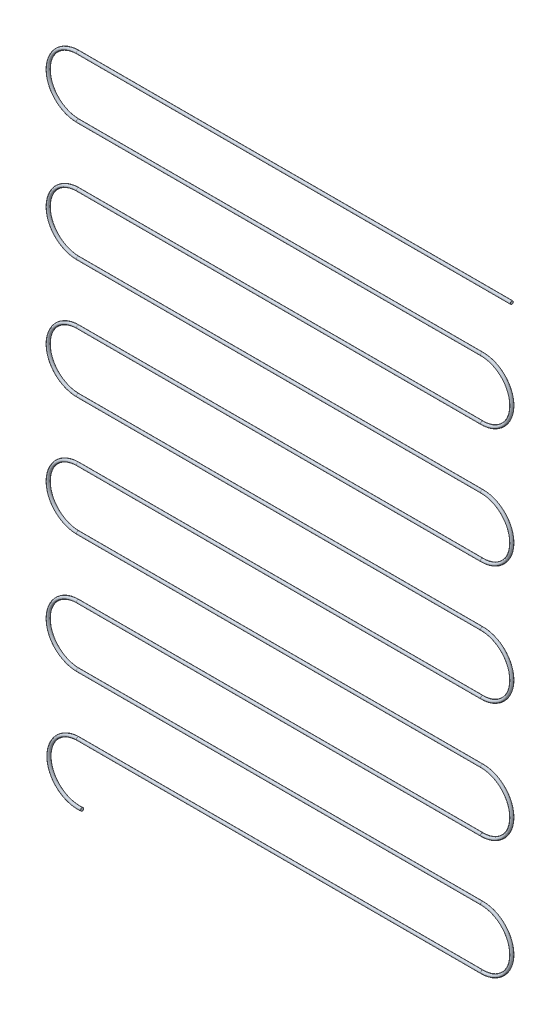
ISO-10303-21;
HEADER;
FILE_DESCRIPTION(('STEP AP214'),'2;1');
FILE_NAME('part.step','',(''),(''),'','','');
FILE_SCHEMA(('AUTOMOTIVE_DESIGN { 1 0 10303 214 1 1 1 1 }'));
ENDSEC;
DATA;
#1=APPLICATION_CONTEXT('core data for automotive mechanical design processes');
#2=APPLICATION_PROTOCOL_DEFINITION('international standard','automotive_design',2000,#1);
#3=PRODUCT_CONTEXT('',#1,'mechanical');
#4=PRODUCT('Part','Part','',(#3));
#5=PRODUCT_RELATED_PRODUCT_CATEGORY('part','',(#4));
#6=PRODUCT_DEFINITION_FORMATION('','',#4);
#7=PRODUCT_DEFINITION_CONTEXT('part definition',#1,'design');
#8=PRODUCT_DEFINITION('design','',#6,#7);
#9=PRODUCT_DEFINITION_SHAPE('','',#8);
#10=(LENGTH_UNIT() NAMED_UNIT(*) SI_UNIT(.MILLI.,.METRE.));
#11=(NAMED_UNIT(*) PLANE_ANGLE_UNIT() SI_UNIT($,.RADIAN.));
#12=(NAMED_UNIT(*) SI_UNIT($,.STERADIAN.) SOLID_ANGLE_UNIT());
#13=UNCERTAINTY_MEASURE_WITH_UNIT(LENGTH_MEASURE(1.E-05),#10,'distance_accuracy_value','');
#14=(GEOMETRIC_REPRESENTATION_CONTEXT(3) GLOBAL_UNCERTAINTY_ASSIGNED_CONTEXT((#13)) GLOBAL_UNIT_ASSIGNED_CONTEXT((#10,
#11,#12)) REPRESENTATION_CONTEXT('',''));
#15=CARTESIAN_POINT('',(0.,0.,0.));
#16=DIRECTION('',(0.,0.,1.));
#17=DIRECTION('',(1.,0.,0.));
#18=AXIS2_PLACEMENT_3D('',#15,#16,#17);
#19=CARTESIAN_POINT('',(-357.844847220324,-1099.64298758842,0.));
#20=DIRECTION('',(-0.993220480265087,-0.11624576371632,0.));
#21=DIRECTION('',(0.11624576371632,-0.993220480265087,0.));
#22=AXIS2_PLACEMENT_3D('',#19,#20,#21);
#23=PLANE('',#22);
#24=CARTESIAN_POINT('',(-357.844847220324,-1099.64298758842,0.));
#25=DIRECTION('',(-0.993220480265087,-0.11624576371632,0.));
#26=DIRECTION('',(0.11624576371632,-0.993220480265087,0.));
#27=AXIS2_PLACEMENT_3D('',#24,#25,#26);
#28=CIRCLE('',#27,2.5);
#29=CARTESIAN_POINT('',(-357.554232811033,-1102.12603878908,0.));
#30=VERTEX_POINT('',#29);
#31=EDGE_CURVE('E51',#30,#30,#28,.T.);
#32=ORIENTED_EDGE('',*,*,#31,.F.);
#33=EDGE_LOOP('',(#32));
#34=FACE_BOUND('',#33,.T.);
#35=ADVANCED_FACE('F48',(#34),#23,.F.);
#36=CARTESIAN_POINT('',(365.,6.66133814775094E-13,0.));
#37=DIRECTION('',(1.,0.,0.));
#38=DIRECTION('',(0.,1.,0.));
#39=AXIS2_PLACEMENT_3D('',#36,#37,#38);
#40=PLANE('',#39);
#41=CARTESIAN_POINT('',(365.,6.66133814775094E-13,0.));
#42=DIRECTION('',(1.,0.,0.));
#43=DIRECTION('',(0.,1.,0.));
#44=AXIS2_PLACEMENT_3D('',#41,#42,#43);
#45=CIRCLE('',#44,2.5);
#46=CARTESIAN_POINT('',(365.,2.50000000000067,0.));
#47=VERTEX_POINT('',#46);
#48=EDGE_CURVE('E66',#47,#47,#45,.T.);
#49=ORIENTED_EDGE('',*,*,#48,.T.);
#50=EDGE_LOOP('',(#49));
#51=FACE_BOUND('',#50,.T.);
#52=ADVANCED_FACE('F113',(#51),#40,.T.);
#53=CARTESIAN_POINT('',(-364.86722782874,-997.495530315425,0.));
#54=CARTESIAN_POINT('',(-364.933870446839,-997.497320817364,0.));
#55=CARTESIAN_POINT('',(-364.998847010349,-997.499066206907,0.));
#56=CARTESIAN_POINT('',(-365.929524049638,-997.524075682964,0.));
#57=CARTESIAN_POINT('',(-366.833270109385,-997.57067739871,0.));
#58=CARTESIAN_POINT('',(-368.595187000103,-997.707243137863,0.));
#59=CARTESIAN_POINT('',(-369.474390473555,-997.797768348357,0.));
#60=CARTESIAN_POINT('',(-372.10345437977,-998.135725064909,0.));
#61=CARTESIAN_POINT('',(-373.844766537137,-998.449597190016,0.));
#62=CARTESIAN_POINT('',(-379.007858688493,-999.652094234148,0.));
#63=CARTESIAN_POINT('',(-382.368085047218,-1000.80228566006,0.));
#64=CARTESIAN_POINT('',(-392.00201504705,-1005.22954214687,0.));
#65=CARTESIAN_POINT('',(-397.817772851678,-1009.4941595461,0.));
#66=CARTESIAN_POINT('',(-407.309443506383,-1019.97050870394,0.));
#67=CARTESIAN_POINT('',(-410.981179331894,-1026.17763009587,0.));
#68=CARTESIAN_POINT('',(-415.591752693927,-1039.54132407892,0.));
#69=CARTESIAN_POINT('',(-416.528561228553,-1046.69201563133,0.));
#70=CARTESIAN_POINT('',(-415.516041531978,-1060.7923882332,0.));
#71=CARTESIAN_POINT('',(-413.567158889359,-1067.73586404197,0.));
#72=CARTESIAN_POINT('',(-407.094494485677,-1080.30369278371,0.));
#73=CARTESIAN_POINT('',(-402.573561191051,-1085.92251490476,0.));
#74=CARTESIAN_POINT('',(-391.682420698379,-1094.93521496285,0.));
#75=CARTESIAN_POINT('',(-385.317006393823,-1098.32512663059,0.));
#76=CARTESIAN_POINT('',(-371.760139355471,-1102.33225251878,0.));
#77=CARTESIAN_POINT('',(-364.576068519075,-1102.94786905796,0.));
#78=CARTESIAN_POINT('',(-357.554232811033,-1102.12603878908,0.));
#79=CARTESIAN_POINT('',(-364.86722782874,-997.495530315425,5.));
#80=CARTESIAN_POINT('',(-364.933870446839,-997.497320817364,5.));
#81=CARTESIAN_POINT('',(-364.998847010349,-997.499066206907,5.));
#82=CARTESIAN_POINT('',(-365.929524049638,-997.524075682964,5.));
#83=CARTESIAN_POINT('',(-366.833270109385,-997.57067739871,5.));
#84=CARTESIAN_POINT('',(-368.595187000103,-997.707243137863,5.));
#85=CARTESIAN_POINT('',(-369.474390473555,-997.797768348357,5.));
#86=CARTESIAN_POINT('',(-372.10345437977,-998.135725064909,5.));
#87=CARTESIAN_POINT('',(-373.844766537137,-998.449597190016,5.));
#88=CARTESIAN_POINT('',(-379.007858688493,-999.652094234148,5.));
#89=CARTESIAN_POINT('',(-382.368085047218,-1000.80228566006,5.));
#90=CARTESIAN_POINT('',(-392.00201504705,-1005.22954214687,5.));
#91=CARTESIAN_POINT('',(-397.817772851678,-1009.4941595461,5.));
#92=CARTESIAN_POINT('',(-407.309443506383,-1019.97050870394,5.));
#93=CARTESIAN_POINT('',(-410.981179331894,-1026.17763009587,5.));
#94=CARTESIAN_POINT('',(-415.591752693927,-1039.54132407892,5.));
#95=CARTESIAN_POINT('',(-416.528561228553,-1046.69201563133,5.));
#96=CARTESIAN_POINT('',(-415.516041531978,-1060.7923882332,5.));
#97=CARTESIAN_POINT('',(-413.567158889359,-1067.73586404197,5.));
#98=CARTESIAN_POINT('',(-407.094494485677,-1080.30369278371,5.));
#99=CARTESIAN_POINT('',(-402.573561191051,-1085.92251490476,5.));
#100=CARTESIAN_POINT('',(-391.682420698379,-1094.93521496285,5.));
#101=CARTESIAN_POINT('',(-385.317006393823,-1098.32512663059,5.));
#102=CARTESIAN_POINT('',(-371.760139355471,-1102.33225251878,5.));
#103=CARTESIAN_POINT('',(-364.576068519075,-1102.94786905796,5.));
#104=CARTESIAN_POINT('',(-357.554232811033,-1102.12603878908,5.));
#105=CARTESIAN_POINT('',(-364.732940183321,-1002.49372667294,5.));
#106=CARTESIAN_POINT('',(-364.799582801419,-1002.49551717488,5.));
#107=CARTESIAN_POINT('',(-364.8678914948,-1002.49735212284,5.));
#108=CARTESIAN_POINT('',(-365.753169661005,-1002.52114140305,5.));
#109=CARTESIAN_POINT('',(-366.53078109005,-1002.56222846328,5.));
#110=CARTESIAN_POINT('',(-368.124896372084,-1002.68578794127,5.));
#111=CARTESIAN_POINT('',(-368.920366181431,-1002.76769170323,5.));
#112=CARTESIAN_POINT('',(-371.299043048926,-1003.07346206601,5.));
#113=CARTESIAN_POINT('',(-372.874515953188,-1003.35744160756,5.));
#114=CARTESIAN_POINT('',(-377.545885042644,-1004.44541512395,5.));
#115=CARTESIAN_POINT('',(-380.586089843217,-1005.48606450942,5.));
#116=CARTESIAN_POINT('',(-389.302502700475,-1009.49167752039,5.));
#117=CARTESIAN_POINT('',(-394.564378809157,-1013.35014088291,5.));
#118=CARTESIAN_POINT('',(-403.152080830258,-1022.82874250049,5.));
#119=CARTESIAN_POINT('',(-406.474127529263,-1028.44470947531,5.));
#120=CARTESIAN_POINT('',(-410.645598666697,-1040.53567069715,5.));
#121=CARTESIAN_POINT('',(-411.493187340171,-1047.00534400658,5.));
#122=CARTESIAN_POINT('',(-410.577098091957,-1059.76282398041,5.));
#123=CARTESIAN_POINT('',(-408.813823319671,-1066.04501637932,5.));
#124=CARTESIAN_POINT('',(-402.957603144626,-1077.41590904871,5.));
#125=CARTESIAN_POINT('',(-398.867234926889,-1082.49960525372,5.));
#126=CARTESIAN_POINT('',(-389.013345907574,-1090.65395292653,5.));
#127=CARTESIAN_POINT('',(-383.254161537444,-1093.72101586337,5.));
#128=CARTESIAN_POINT('',(-370.988424694039,-1097.34651071466,5.));
#129=CARTESIAN_POINT('',(-364.488551080006,-1097.90349710918,5.));
#130=CARTESIAN_POINT('',(-358.135461629614,-1097.15993638775,5.));
#131=CARTESIAN_POINT('',(-364.732940183321,-1002.49372667294,0.));
#132=CARTESIAN_POINT('',(-364.799582801419,-1002.49551717488,0.));
#133=CARTESIAN_POINT('',(-364.8678914948,-1002.49735212284,0.));
#134=CARTESIAN_POINT('',(-365.753169661005,-1002.52114140305,0.));
#135=CARTESIAN_POINT('',(-366.53078109005,-1002.56222846328,0.));
#136=CARTESIAN_POINT('',(-368.124896372084,-1002.68578794127,0.));
#137=CARTESIAN_POINT('',(-368.920366181431,-1002.76769170323,0.));
#138=CARTESIAN_POINT('',(-371.299043048926,-1003.07346206601,0.));
#139=CARTESIAN_POINT('',(-372.874515953188,-1003.35744160756,0.));
#140=CARTESIAN_POINT('',(-377.545885042644,-1004.44541512395,0.));
#141=CARTESIAN_POINT('',(-380.586089843217,-1005.48606450942,0.));
#142=CARTESIAN_POINT('',(-389.302502700475,-1009.49167752039,0.));
#143=CARTESIAN_POINT('',(-394.564378809157,-1013.35014088291,0.));
#144=CARTESIAN_POINT('',(-403.152080830258,-1022.82874250049,0.));
#145=CARTESIAN_POINT('',(-406.474127529263,-1028.44470947531,0.));
#146=CARTESIAN_POINT('',(-410.645598666697,-1040.53567069715,0.));
#147=CARTESIAN_POINT('',(-411.493187340171,-1047.00534400658,0.));
#148=CARTESIAN_POINT('',(-410.577098091957,-1059.76282398041,0.));
#149=CARTESIAN_POINT('',(-408.813823319671,-1066.04501637932,0.));
#150=CARTESIAN_POINT('',(-402.957603144626,-1077.41590904871,0.));
#151=CARTESIAN_POINT('',(-398.867234926889,-1082.49960525372,0.));
#152=CARTESIAN_POINT('',(-389.013345907574,-1090.65395292653,0.));
#153=CARTESIAN_POINT('',(-383.254161537444,-1093.72101586337,0.));
#154=CARTESIAN_POINT('',(-370.988424694039,-1097.34651071466,0.));
#155=CARTESIAN_POINT('',(-364.488551080006,-1097.90349710918,0.));
#156=CARTESIAN_POINT('',(-358.135461629614,-1097.15993638775,0.));
#157=CARTESIAN_POINT('',(-364.732940183321,-1002.49372667294,-5.));
#158=CARTESIAN_POINT('',(-364.799582801419,-1002.49551717488,-5.));
#159=CARTESIAN_POINT('',(-364.8678914948,-1002.49735212284,-5.));
#160=CARTESIAN_POINT('',(-365.753169661005,-1002.52114140305,-5.));
#161=CARTESIAN_POINT('',(-366.53078109005,-1002.56222846328,-5.));
#162=CARTESIAN_POINT('',(-368.124896372084,-1002.68578794127,-5.));
#163=CARTESIAN_POINT('',(-368.920366181431,-1002.76769170323,-5.));
#164=CARTESIAN_POINT('',(-371.299043048926,-1003.07346206601,-5.));
#165=CARTESIAN_POINT('',(-372.874515953188,-1003.35744160756,-5.));
#166=CARTESIAN_POINT('',(-377.545885042644,-1004.44541512395,-5.));
#167=CARTESIAN_POINT('',(-380.586089843217,-1005.48606450942,-5.));
#168=CARTESIAN_POINT('',(-389.302502700475,-1009.49167752039,-5.));
#169=CARTESIAN_POINT('',(-394.564378809157,-1013.35014088291,-5.));
#170=CARTESIAN_POINT('',(-403.152080830258,-1022.82874250049,-5.));
#171=CARTESIAN_POINT('',(-406.474127529263,-1028.44470947531,-5.));
#172=CARTESIAN_POINT('',(-410.645598666697,-1040.53567069715,-5.));
#173=CARTESIAN_POINT('',(-411.493187340171,-1047.00534400658,-5.));
#174=CARTESIAN_POINT('',(-410.577098091957,-1059.76282398041,-5.));
#175=CARTESIAN_POINT('',(-408.813823319671,-1066.04501637932,-5.));
#176=CARTESIAN_POINT('',(-402.957603144626,-1077.41590904871,-5.));
#177=CARTESIAN_POINT('',(-398.867234926889,-1082.49960525372,-5.));
#178=CARTESIAN_POINT('',(-389.013345907574,-1090.65395292653,-5.));
#179=CARTESIAN_POINT('',(-383.254161537444,-1093.72101586337,-5.));
#180=CARTESIAN_POINT('',(-370.988424694039,-1097.34651071466,-5.));
#181=CARTESIAN_POINT('',(-364.488551080006,-1097.90349710918,-5.));
#182=CARTESIAN_POINT('',(-358.135461629614,-1097.15993638775,-5.));
#183=CARTESIAN_POINT('',(-364.86722782874,-997.495530315425,-5.));
#184=CARTESIAN_POINT('',(-364.933870446839,-997.497320817364,-5.));
#185=CARTESIAN_POINT('',(-364.998847010349,-997.499066206907,-5.));
#186=CARTESIAN_POINT('',(-365.929524049638,-997.524075682964,-5.));
#187=CARTESIAN_POINT('',(-366.833270109385,-997.57067739871,-5.));
#188=CARTESIAN_POINT('',(-368.595187000103,-997.707243137863,-5.));
#189=CARTESIAN_POINT('',(-369.474390473555,-997.797768348357,-5.));
#190=CARTESIAN_POINT('',(-372.10345437977,-998.135725064909,-5.));
#191=CARTESIAN_POINT('',(-373.844766537137,-998.449597190016,-5.));
#192=CARTESIAN_POINT('',(-379.007858688493,-999.652094234148,-5.));
#193=CARTESIAN_POINT('',(-382.368085047218,-1000.80228566006,-5.));
#194=CARTESIAN_POINT('',(-392.00201504705,-1005.22954214687,-5.));
#195=CARTESIAN_POINT('',(-397.817772851678,-1009.4941595461,-5.));
#196=CARTESIAN_POINT('',(-407.309443506383,-1019.97050870394,-5.));
#197=CARTESIAN_POINT('',(-410.981179331894,-1026.17763009587,-5.));
#198=CARTESIAN_POINT('',(-415.591752693927,-1039.54132407892,-5.));
#199=CARTESIAN_POINT('',(-416.528561228553,-1046.69201563133,-5.));
#200=CARTESIAN_POINT('',(-415.516041531978,-1060.7923882332,-5.));
#201=CARTESIAN_POINT('',(-413.567158889359,-1067.73586404197,-5.));
#202=CARTESIAN_POINT('',(-407.094494485677,-1080.30369278371,-5.));
#203=CARTESIAN_POINT('',(-402.573561191051,-1085.92251490476,-5.));
#204=CARTESIAN_POINT('',(-391.682420698379,-1094.93521496285,-5.));
#205=CARTESIAN_POINT('',(-385.317006393823,-1098.32512663059,-5.));
#206=CARTESIAN_POINT('',(-371.760139355471,-1102.33225251878,-5.));
#207=CARTESIAN_POINT('',(-364.576068519075,-1102.94786905796,-5.));
#208=CARTESIAN_POINT('',(-357.554232811033,-1102.12603878908,-5.));
#209=CARTESIAN_POINT('',(-364.86722782874,-997.495530315425,0.));
#210=CARTESIAN_POINT('',(-364.933870446839,-997.497320817364,0.));
#211=CARTESIAN_POINT('',(-364.998847010349,-997.499066206907,0.));
#212=CARTESIAN_POINT('',(-365.929524049638,-997.524075682964,0.));
#213=CARTESIAN_POINT('',(-366.833270109385,-997.57067739871,0.));
#214=CARTESIAN_POINT('',(-368.595187000103,-997.707243137863,0.));
#215=CARTESIAN_POINT('',(-369.474390473555,-997.797768348357,0.));
#216=CARTESIAN_POINT('',(-372.10345437977,-998.135725064909,0.));
#217=CARTESIAN_POINT('',(-373.844766537137,-998.449597190016,0.));
#218=CARTESIAN_POINT('',(-379.007858688493,-999.652094234148,0.));
#219=CARTESIAN_POINT('',(-382.368085047218,-1000.80228566006,0.));
#220=CARTESIAN_POINT('',(-392.00201504705,-1005.22954214687,0.));
#221=CARTESIAN_POINT('',(-397.817772851678,-1009.4941595461,0.));
#222=CARTESIAN_POINT('',(-407.309443506383,-1019.97050870394,0.));
#223=CARTESIAN_POINT('',(-410.981179331894,-1026.17763009587,0.));
#224=CARTESIAN_POINT('',(-415.591752693927,-1039.54132407892,0.));
#225=CARTESIAN_POINT('',(-416.528561228553,-1046.69201563133,0.));
#226=CARTESIAN_POINT('',(-415.516041531978,-1060.7923882332,0.));
#227=CARTESIAN_POINT('',(-413.567158889359,-1067.73586404197,0.));
#228=CARTESIAN_POINT('',(-407.094494485677,-1080.30369278371,0.));
#229=CARTESIAN_POINT('',(-402.573561191051,-1085.92251490476,0.));
#230=CARTESIAN_POINT('',(-391.682420698379,-1094.93521496285,0.));
#231=CARTESIAN_POINT('',(-385.317006393823,-1098.32512663059,0.));
#232=CARTESIAN_POINT('',(-371.760139355471,-1102.33225251878,0.));
#233=CARTESIAN_POINT('',(-364.576068519075,-1102.94786905796,0.));
#234=CARTESIAN_POINT('',(-357.554232811033,-1102.12603878908,0.));
#235=(BOUNDED_SURFACE() B_SPLINE_SURFACE(3,3,((#53,#54,#55,#56,#57,#58,#59,#60,#61,#62,#63,#64,
#65,#66,#67,#68,#69,#70,#71,#72,#73,#74,#75,#76,#77,#78),(#79,#80,#81,#82,#83,#84,#85,#86,#87,
#88,#89,#90,#91,#92,#93,#94,#95,#96,#97,#98,#99,#100,#101,#102,#103,#104),(#105,#106,#107,#108,
#109,#110,#111,#112,#113,#114,#115,#116,#117,#118,#119,#120,#121,#122,#123,#124,#125,#126,#127,
#128,#129,#130),(#131,#132,#133,#134,#135,#136,#137,#138,#139,#140,#141,#142,#143,#144,#145,
#146,#147,#148,#149,#150,#151,#152,#153,#154,#155,#156),(#157,#158,#159,#160,#161,#162,#163,
#164,#165,#166,#167,#168,#169,#170,#171,#172,#173,#174,#175,#176,#177,#178,#179,#180,#181,#182),
(#183,#184,#185,#186,#187,#188,#189,#190,#191,#192,#193,#194,#195,#196,#197,#198,#199,#200,#201,
#202,#203,#204,#205,#206,#207,#208),(#209,#210,#211,#212,#213,#214,#215,#216,#217,#218,#219,
#220,#221,#222,#223,#224,#225,#226,#227,#228,#229,#230,#231,#232,#233,#234)),.UNSPECIFIED.,.T.,
.F.,.F.) B_SPLINE_SURFACE_WITH_KNOTS((4,3,4),(4,2,2,2,2,2,2,2,2,2,2,2,4),(0.,0.5,1.),
(-0.00123766484504623,0.,0.015625,0.03125,0.0625,0.125,0.25,0.375,0.5,0.625,0.75,0.875,1.),
.UNSPECIFIED.) GEOMETRIC_REPRESENTATION_ITEM() RATIONAL_B_SPLINE_SURFACE(((1.,1.,1.,1.,1.,1.,1.,
1.,1.,1.,1.,1.,1.,1.,1.,1.,1.,1.,1.,1.,1.,1.,1.,1.,1.,1.),(0.333333333333333,0.333333333333333,
0.333333333333333,0.333333333333333,0.333333333333333,0.333333333333333,0.333333333333333,
0.333333333333333,0.333333333333333,0.333333333333333,0.333333333333333,0.333333333333333,
0.333333333333333,0.333333333333333,0.333333333333333,0.333333333333333,0.333333333333333,
0.333333333333333,0.333333333333333,0.333333333333333,0.333333333333333,0.333333333333333,
0.333333333333333,0.333333333333333,0.333333333333333,0.333333333333333),(0.333333333333333,
0.333333333333333,0.333333333333333,0.333333333333333,0.333333333333333,0.333333333333333,
0.333333333333333,0.333333333333333,0.333333333333333,0.333333333333333,0.333333333333333,
0.333333333333333,0.333333333333333,0.333333333333333,0.333333333333333,0.333333333333333,
0.333333333333333,0.333333333333333,0.333333333333333,0.333333333333333,0.333333333333333,
0.333333333333333,0.333333333333333,0.333333333333333,0.333333333333333,0.333333333333333),(1.,
1.,1.,1.,1.,1.,1.,1.,1.,1.,1.,1.,1.,1.,1.,1.,1.,1.,1.,1.,1.,1.,1.,1.,1.,1.),(0.333333333333333,
0.333333333333333,0.333333333333333,0.333333333333333,0.333333333333333,0.333333333333333,
0.333333333333333,0.333333333333333,0.333333333333333,0.333333333333333,0.333333333333333,
0.333333333333333,0.333333333333333,0.333333333333333,0.333333333333333,0.333333333333333,
0.333333333333333,0.333333333333333,0.333333333333333,0.333333333333333,0.333333333333333,
0.333333333333333,0.333333333333333,0.333333333333333,0.333333333333333,0.333333333333333),
(0.333333333333333,0.333333333333333,0.333333333333333,0.333333333333333,0.333333333333333,
0.333333333333333,0.333333333333333,0.333333333333333,0.333333333333333,0.333333333333333,
0.333333333333333,0.333333333333333,0.333333333333333,0.333333333333333,0.333333333333333,
0.333333333333333,0.333333333333333,0.333333333333333,0.333333333333333,0.333333333333333,
0.333333333333333,0.333333333333333,0.333333333333333,0.333333333333333,0.333333333333333,
0.333333333333333),(1.,1.,1.,1.,1.,1.,1.,1.,1.,1.,1.,1.,1.,1.,1.,1.,1.,1.,1.,1.,1.,1.,1.,1.,1.,1.))) REPRESENTATION_ITEM('') SURFACE());
#236=CARTESIAN_POINT('',(-365.000011860308,-999.999999999999,-2.5));
#237=CARTESIAN_POINT('',(-364.99973867554,-1000.02033582867,-2.50000040601214));
#238=CARTESIAN_POINT('',(-364.999465374241,-1000.0406740943,-2.4997521084906));
#239=CARTESIAN_POINT('',(-364.998249043116,-1000.13116228146,-2.49754211735846));
#240=CARTESIAN_POINT('',(-364.9973057337,-1000.20126553608,-2.49287296152864));
#241=CARTESIAN_POINT('',(-364.995425611917,-1000.34084498965,-2.47765177747586));
#242=CARTESIAN_POINT('',(-364.994488802159,-1000.41032093994,-2.46709751226027));
#243=CARTESIAN_POINT('',(-364.992626688457,-1000.54828042206,-2.44015053879925));
#244=CARTESIAN_POINT('',(-364.991701410621,-1000.61676174534,-2.42374644372307));
#245=CARTESIAN_POINT('',(-364.989870543587,-1000.75213494821,-2.38521621534027));
#246=CARTESIAN_POINT('',(-364.988964970526,-1000.8190255289,-2.36308557016435));
#247=CARTESIAN_POINT('',(-364.986291912947,-1001.01628568677,-2.28842056760489));
#248=CARTESIAN_POINT('',(-364.98456323439,-1001.14360330273,-2.22754249266262));
#249=CARTESIAN_POINT('',(-364.981263891583,-1001.38619676374,-2.085242178959));
#250=CARTESIAN_POINT('',(-364.979693234168,-1001.50147208784,-2.00381905193871));
#251=CARTESIAN_POINT('',(-364.977491343589,-1001.66284636312,-1.86812880158315));
#252=CARTESIAN_POINT('',(-364.976782668282,-1001.71474347047,-1.82060553303444));
#253=CARTESIAN_POINT('',(-364.975422080239,-1001.81431418456,-1.72139278468549));
#254=CARTESIAN_POINT('',(-364.974770113388,-1001.86199181854,-1.66970736943083));
#255=CARTESIAN_POINT('',(-364.973526983541,-1001.95284574056,-1.56247678349266));
#256=CARTESIAN_POINT('',(-364.972935850126,-1001.9960198389,-1.50692975689035));
#257=CARTESIAN_POINT('',(-364.971819098211,-1002.07753954058,-1.39240016316488));
#258=CARTESIAN_POINT('',(-364.971293494926,-1002.11588402268,-1.33341680290219));
#259=CARTESIAN_POINT('',(-364.969821651136,-1002.22321071294,-1.1519684829027));
#260=CARTESIAN_POINT('',(-364.96897893805,-1002.28459123137,-1.02488104678755));
#261=CARTESIAN_POINT('',(-364.967598177603,-1002.38510685591,-0.762273051944443));
#262=CARTESIAN_POINT('',(-364.967060124711,-1002.42424236598,-0.626752646403522));
#263=CARTESIAN_POINT('',(-364.96630418009,-1002.47921432091,-0.351057417708006));
#264=CARTESIAN_POINT('',(-364.966086264825,-1002.49505247861,-0.210882937502319));
#265=CARTESIAN_POINT('',(-364.965977393599,-1002.50296613979,0.0701353262376907));
#266=CARTESIAN_POINT('',(-364.966086437599,-1002.49504164608,0.210979109692335));
#267=CARTESIAN_POINT('',(-364.966627912531,-1002.45567430441,0.489314811850567));
#268=CARTESIAN_POINT('',(-364.967060328509,-1002.42423254402,0.626806885254029));
#269=CARTESIAN_POINT('',(-364.968236179262,-1002.33867030505,0.89462548240438));
#270=CARTESIAN_POINT('',(-364.968979619024,-1002.28454946295,1.02495189125416));
#271=CARTESIAN_POINT('',(-364.970309641254,-1002.18762523951,1.21213016045043));
#272=CARTESIAN_POINT('',(-364.970789107609,-1002.15267033928,1.27316822348023));
#273=CARTESIAN_POINT('',(-364.971816256866,-1002.07774569997,1.39208601172764));
#274=CARTESIAN_POINT('',(-364.972363923953,-1002.03777712338,1.44996646462593));
#275=CARTESIAN_POINT('',(-364.973523142504,-1001.95312502916,1.56212583302872));
#276=CARTESIAN_POINT('',(-364.97413466358,-1001.90844375412,1.61640644170832));
#277=CARTESIAN_POINT('',(-364.975417612736,-1001.81463971562,1.72105509253343));
#278=CARTESIAN_POINT('',(-364.976089098033,-1001.76551270952,1.77141931016471));
#279=CARTESIAN_POINT('',(-364.978184973306,-1001.61205984419,1.91597756150312));
#280=CARTESIAN_POINT('',(-364.979692113176,-1001.50156505558,2.00376556514761));
#281=CARTESIAN_POINT('',(-364.982880524203,-1001.26739410379,2.15951020925627));
#282=CARTESIAN_POINT('',(-364.984561789185,-1001.14371840806,2.22746755268427));
#283=CARTESIAN_POINT('',(-364.987176617198,-1000.9509974729,2.31313179340143));
#284=CARTESIAN_POINT('',(-364.988064880099,-1000.88546975573,2.33899662070172));
#285=CARTESIAN_POINT('',(-364.989865530248,-1000.75250440376,2.38509489693182));
#286=CARTESIAN_POINT('',(-364.99077789717,-1000.68506837488,2.40533293442071));
#287=CARTESIAN_POINT('',(-364.992618848203,-1000.54886019888,2.44001744314131));
#288=CARTESIAN_POINT('',(-364.99354739975,-1000.48009070887,2.45447439527505));
#289=CARTESIAN_POINT('',(-364.995415532286,-1000.34159228427,2.47754720444675));
#290=CARTESIAN_POINT('',(-364.996355110123,-1000.27186362277,2.48616469033127));
#291=CARTESIAN_POINT('',(-364.997927931463,-1000.15501819666,2.49563283961959));
#292=CARTESIAN_POINT('',(-364.998560016374,-1000.1080276527,2.49810763829164));
#293=CARTESIAN_POINT('',(-364.999465355328,-1000.04067548927,2.4997518563169));
#294=CARTESIAN_POINT('',(-364.999738653252,-1000.02033747048,2.50000008967498));
#295=CARTESIAN_POINT('',(-365.000011860312,-999.999999999999,2.5));
#296=B_SPLINE_CURVE_WITH_KNOTS('',3,(#236,#237,#238,#239,#240,#241,#242,#243,#244,#245,#246,
#247,#248,#249,#250,#251,#252,#253,#254,#255,#256,#257,#258,#259,#260,#261,#262,#263,#264,#265,
#266,#267,#268,#269,#270,#271,#272,#273,#274,#275,#276,#277,#278,#279,#280,#281,#282,#283,#284,
#285,#286,#287,#288,#289,#290,#291,#292,#293,#294,#295),.UNSPECIFIED.,.F.,.F.,(4,2,2,2,2,2,2,2,
2,2,2,2,2,2,2,2,2,2,2,2,2,2,2,2,2,2,2,2,2,4),(0.,0.0610181299958755,0.271536534919297,
0.482135014728155,0.693145687310959,0.904323121185978,1.32559242447189,1.74687994432679,
1.9577873199098,2.16849117498401,2.37929700545938,2.59015168625085,3.01137906353215,
3.43259879134336,3.85378754895246,4.27497625642108,4.69614548676249,5.11732146833012,
5.32813591859894,5.53890157901837,5.74956739292703,5.96043641230002,6.3816977462109,
6.80294414529533,7.01409427180226,7.22507170023549,7.43566488084049,7.64619929488653,
7.78730509272849,7.84832322272583),.UNSPECIFIED.);
#297=CARTESIAN_POINT('',(-365.000011860308,-999.999999999999,-2.5));
#298=VERTEX_POINT('',#297);
#299=CARTESIAN_POINT('',(-365.000011860312,-999.999999999999,2.5));
#300=VERTEX_POINT('',#299);
#301=EDGE_CURVE('E80',#298,#300,#296,.T.);
#302=CARTESIAN_POINT('',(-365.000011860308,-999.999999999999,-2.5));
#303=CARTESIAN_POINT('',(-365.000285045478,-999.979664171341,-2.50000040601267));
#304=CARTESIAN_POINT('',(-365.000558263009,-999.959325904575,-2.49975210849053));
#305=CARTESIAN_POINT('',(-365.001773846915,-999.868837917066,-2.49754212211302));
#306=CARTESIAN_POINT('',(-365.002715582356,-999.798734850739,-2.49287298781513));
#307=CARTESIAN_POINT('',(-365.004590621331,-999.65915574388,-2.47765187338144));
#308=CARTESIAN_POINT('',(-365.005523921523,-999.58967995199,-2.46709765629139));
#309=CARTESIAN_POINT('',(-365.00737718239,-999.451720758163,-2.44015079955282));
#310=CARTESIAN_POINT('',(-365.008297113382,-999.383239564697,-2.42374677323625));
#311=CARTESIAN_POINT('',(-365.010115616516,-999.247866592814,-2.38521669739821));
#312=CARTESIAN_POINT('',(-365.011014171204,-999.180976113284,-2.36308613600781));
#313=CARTESIAN_POINT('',(-365.013663996699,-998.983716206457,-2.28842139512816));
#314=CARTESIAN_POINT('',(-365.015374259688,-998.856398703089,-2.22754351158915));
#315=CARTESIAN_POINT('',(-365.018633006366,-998.613805401461,-2.08524360667213));
#316=CARTESIAN_POINT('',(-365.020181483056,-998.498530124129,-2.00382069706624));
#317=CARTESIAN_POINT('',(-365.022349187198,-998.337155963136,-1.86813086538351));
#318=CARTESIAN_POINT('',(-365.023046306536,-998.285258933222,-1.82060778959241));
#319=CARTESIAN_POINT('',(-365.024383808732,-998.185688352055,-1.7213954503837));
#320=CARTESIAN_POINT('',(-365.025024245692,-998.138010773567,-1.6697102514933));
#321=CARTESIAN_POINT('',(-365.026244651952,-998.047156938496,-1.56248012280292));
#322=CARTESIAN_POINT('',(-365.026824591839,-998.003982871629,-1.50693333707834));
#323=CARTESIAN_POINT('',(-365.027919610459,-997.922463205466,-1.39240424945967));
#324=CARTESIAN_POINT('',(-365.028434674132,-997.884118727406,-1.33342115442521));
#325=CARTESIAN_POINT('',(-365.02987634382,-997.776791860474,-1.15197342668736));
#326=CARTESIAN_POINT('',(-365.030700837376,-997.715411154239,-1.02488632948169));
#327=CARTESIAN_POINT('',(-365.032051012264,-997.614895074456,-0.762279046532588));
#328=CARTESIAN_POINT('',(-365.032576699015,-997.575759297511,-0.626759013763892));
#329=CARTESIAN_POINT('',(-365.033315112887,-997.520786589038,-0.351063955355214));
#330=CARTESIAN_POINT('',(-365.033527861724,-997.504948040786,-0.210889253418843));
#331=CARTESIAN_POINT('',(-365.033634170161,-997.497033682491,0.0701295092792106));
#332=CARTESIAN_POINT('',(-365.033527729794,-997.504957870038,0.210973569973042));
#333=CARTESIAN_POINT('',(-365.032998939684,-997.544324747774,0.489310230196769));
#334=CARTESIAN_POINT('',(-365.032576603788,-997.575766407097,0.626802976355389));
#335=CARTESIAN_POINT('',(-365.031427296657,-997.661328682289,0.894622937566873));
#336=CARTESIAN_POINT('',(-365.03070032054,-997.71544966158,1.02495003775641));
#337=CARTESIAN_POINT('',(-365.029398383057,-997.812374229211,1.21212921619146));
#338=CARTESIAN_POINT('',(-365.02892884985,-997.84732923441,1.27316751741766));
#339=CARTESIAN_POINT('',(-365.027922418789,-997.922254131097,1.39208577300683));
#340=CARTESIAN_POINT('',(-365.027385536552,-997.962222860087,1.44996645505566));
#341=CARTESIAN_POINT('',(-365.026248434966,-998.046875304352,1.56212626258408));
#342=CARTESIAN_POINT('',(-365.025648245746,-998.09155677688,1.61640708134961));
#343=CARTESIAN_POINT('',(-365.024388202472,-998.185361253552,1.72105612640993));
#344=CARTESIAN_POINT('',(-365.023728291425,-998.234488500369,1.77142052816375));
#345=CARTESIAN_POINT('',(-365.021666999477,-998.387941445041,1.91597862008297));
#346=CARTESIAN_POINT('',(-365.020182747817,-998.49843601671,2.00376634474045));
#347=CARTESIAN_POINT('',(-365.01703715984,-998.732606457767,2.15951051632688));
#348=CARTESIAN_POINT('',(-365.015375829806,-998.856281859508,2.22746766651184));
#349=CARTESIAN_POINT('',(-365.012786997823,-999.049002279979,2.31313168612231));
#350=CARTESIAN_POINT('',(-365.011906756769,-999.114529811529,2.33899645076639));
#351=CARTESIAN_POINT('',(-365.010120611279,-999.247494766653,2.38509462918423));
#352=CARTESIAN_POINT('',(-365.009214728421,-999.31493058431,2.40533263148415));
#353=CARTESIAN_POINT('',(-365.007385006505,-999.451138313915,2.44001710228796));
#354=CARTESIAN_POINT('',(-365.006461203155,-999.519907568833,2.45447405144337));
#355=CARTESIAN_POINT('',(-365.004600699693,-999.658405497581,2.47754689179352));
#356=CARTESIAN_POINT('',(-365.003664003253,-999.728133898337,2.48616441176715));
#357=CARTESIAN_POINT('',(-365.002094344151,-999.844979970279,2.49563274317724));
#358=CARTESIAN_POINT('',(-365.001463079385,-999.89197143162,2.49810761585876));
#359=CARTESIAN_POINT('',(-365.000558281746,-999.959324509663,2.49975185632517));
#360=CARTESIAN_POINT('',(-365.000285067533,-999.979662529592,2.50000008968656));
#361=CARTESIAN_POINT('',(-365.000011860312,-999.999999999999,2.5));
#362=B_SPLINE_CURVE_WITH_KNOTS('',3,(#302,#303,#304,#305,#306,#307,#308,#309,#310,#311,#312,
#313,#314,#315,#316,#317,#318,#319,#320,#321,#322,#323,#324,#325,#326,#327,#328,#329,#330,#331,
#332,#333,#334,#335,#336,#337,#338,#339,#340,#341,#342,#343,#344,#345,#346,#347,#348,#349,#350,
#351,#352,#353,#354,#355,#356,#357,#358,#359,#360,#361),.UNSPECIFIED.,.F.,.F.,(4,2,2,2,2,2,2,2,
2,2,2,2,2,2,2,2,2,2,2,2,2,2,2,2,2,2,2,2,2,4),(0.,0.0610181299962728,0.271535905829494,
0.482133755296241,0.693143791841263,0.904320589600467,1.3255886674657,1.74687496123313,
1.95778143017853,2.16848437926183,2.37928930428031,2.5901430798043,3.01136948179994,
3.4325882449107,3.85377777594473,4.27496726428445,4.69613829128943,5.1173160675824,
5.32813109159899,5.53889732542548,5.74956370641845,5.96043329350182,6.38169288036558,
6.80293752619234,7.01408676477178,7.22506330639889,7.4356556088791,7.64618914711483,
7.78729766681745,7.84831579681386),.UNSPECIFIED.);
#363=EDGE_CURVE('E76',#298,#300,#362,.T.);
#364=ORIENTED_EDGE('',*,*,#301,.T.);
#365=ORIENTED_EDGE('',*,*,#363,.F.);
#366=EDGE_LOOP('',(#364,#365));
#367=FACE_BOUND('',#366,.T.);
#368=ORIENTED_EDGE('',*,*,#31,.T.);
#369=EDGE_LOOP('',(#368));
#370=FACE_BOUND('',#369,.T.);
#371=ADVANCED_FACE('F83',(#367,#370),#235,.F.);
#372=CARTESIAN_POINT('',(314.999988139668,-199.999999999998,0.));
#373=DIRECTION('',(-1.,0.,0.));
#374=DIRECTION('',(0.,-1.,0.));
#375=AXIS2_PLACEMENT_3D('',#372,#373,#374);
#376=CYLINDRICAL_SURFACE('',#375,2.5);
#377=CARTESIAN_POINT('',(-365.000011860332,-199.999999999998,0.));
#378=DIRECTION('',(1.,0.,0.));
#379=DIRECTION('',(0.,1.,0.));
#380=AXIS2_PLACEMENT_3D('',#377,#378,#379);
#381=CIRCLE('',#380,2.5);
#382=CARTESIAN_POINT('',(-365.000011860332,-197.499999999998,0.));
#383=VERTEX_POINT('',#382);
#384=EDGE_CURVE('E250',#383,#383,#381,.T.);
#385=ORIENTED_EDGE('',*,*,#384,.T.);
#386=EDGE_LOOP('',(#385));
#387=FACE_BOUND('',#386,.T.);
#388=CARTESIAN_POINT('',(314.999988139668,-199.999999999998,0.));
#389=DIRECTION('',(0.999999999999972,-2.37206630018805E-07,0.));
#390=DIRECTION('',(2.37206630032682E-07,0.999999999999972,0.));
#391=AXIS2_PLACEMENT_3D('',#388,#389,#390);
#392=CIRCLE('',#391,2.5);
#393=CARTESIAN_POINT('',(314.999988436177,-197.499999999998,0.));
#394=VERTEX_POINT('',#393);
#395=EDGE_CURVE('E12',#394,#394,#392,.T.);
#396=ORIENTED_EDGE('',*,*,#395,.F.);
#397=EDGE_LOOP('',(#396));
#398=FACE_BOUND('',#397,.T.);
#399=ADVANCED_FACE('F112',(#387,#398),#376,.T.);
#400=CARTESIAN_POINT('',(-365.000011860332,-249.999999999999,0.));
#401=DIRECTION('',(0.,0.,1.));
#402=DIRECTION('',(1.,0.,0.));
#403=AXIS2_PLACEMENT_3D('',#400,#401,#402);
#404=TOROIDAL_SURFACE('',#403,50.0000000000004,2.5);
#405=CARTESIAN_POINT('',(-365.000011860332,-299.999999999999,0.));
#406=DIRECTION('',(-1.,0.,0.));
#407=DIRECTION('',(0.,-1.,0.));
#408=AXIS2_PLACEMENT_3D('',#405,#406,#407);
#409=CIRCLE('',#408,2.5);
#410=CARTESIAN_POINT('',(-365.000011860332,-302.499999999999,0.));
#411=VERTEX_POINT('',#410);
#412=EDGE_CURVE('E247',#411,#411,#409,.T.);
#413=CARTESIAN_POINT('',(-365.000011860332,-249.999999999999,0.));
#414=DIRECTION('',(0.,0.,1.));
#415=DIRECTION('',(1.,0.,0.));
#416=AXIS2_PLACEMENT_3D('',#413,#414,#415);
#417=CIRCLE('',#416,52.5000000000004);
#418=EDGE_CURVE('',#383,#411,#417,.T.);
#419=ORIENTED_EDGE('',*,*,#384,.F.);
#420=ORIENTED_EDGE('',*,*,#412,.T.);
#421=ORIENTED_EDGE('',*,*,#418,.T.);
#422=ORIENTED_EDGE('',*,*,#418,.F.);
#423=EDGE_LOOP('',(#419,#421,#420,#422));
#424=FACE_BOUND('',#423,.T.);
#425=ADVANCED_FACE('F141',(#424),#404,.T.);
#426=CARTESIAN_POINT('',(-365.000011860332,-299.999999999999,0.));
#427=DIRECTION('',(1.,0.,0.));
#428=DIRECTION('',(0.,1.,0.));
#429=AXIS2_PLACEMENT_3D('',#426,#427,#428);
#430=CYLINDRICAL_SURFACE('',#429,2.5);
#431=CARTESIAN_POINT('',(314.999988139668,-300.,0.));
#432=DIRECTION('',(-1.,0.,0.));
#433=DIRECTION('',(0.,-1.,0.));
#434=AXIS2_PLACEMENT_3D('',#431,#432,#433);
#435=CIRCLE('',#434,2.5);
#436=CARTESIAN_POINT('',(314.999988139668,-297.5,0.));
#437=VERTEX_POINT('',#436);
#438=EDGE_CURVE('E244',#437,#437,#435,.T.);
#439=ORIENTED_EDGE('',*,*,#438,.T.);
#440=EDGE_LOOP('',(#439));
#441=FACE_BOUND('',#440,.T.);
#442=ORIENTED_EDGE('',*,*,#412,.F.);
#443=EDGE_LOOP('',(#442));
#444=FACE_BOUND('',#443,.T.);
#445=ADVANCED_FACE('F145',(#441,#444),#430,.T.);
#446=CARTESIAN_POINT('',(314.999988139668,-349.999999999999,0.));
#447=DIRECTION('',(0.,0.,-1.));
#448=DIRECTION('',(-1.,0.,0.));
#449=AXIS2_PLACEMENT_3D('',#446,#447,#448);
#450=TOROIDAL_SURFACE('',#449,49.999999999999,2.5);
#451=CARTESIAN_POINT('',(314.999988139668,-399.999999999998,0.));
#452=DIRECTION('',(1.,0.,0.));
#453=DIRECTION('',(0.,1.,0.));
#454=AXIS2_PLACEMENT_3D('',#451,#452,#453);
#455=CIRCLE('',#454,2.5);
#456=CARTESIAN_POINT('',(314.999988139668,-402.499999999998,0.));
#457=VERTEX_POINT('',#456);
#458=EDGE_CURVE('E241',#457,#457,#455,.T.);
#459=CARTESIAN_POINT('',(314.999988139668,-349.999999999999,0.));
#460=DIRECTION('',(0.,0.,-1.));
#461=DIRECTION('',(-1.,0.,0.));
#462=AXIS2_PLACEMENT_3D('',#459,#460,#461);
#463=CIRCLE('',#462,52.499999999999);
#464=EDGE_CURVE('',#437,#457,#463,.T.);
#465=ORIENTED_EDGE('',*,*,#438,.F.);
#466=ORIENTED_EDGE('',*,*,#458,.T.);
#467=ORIENTED_EDGE('',*,*,#464,.T.);
#468=ORIENTED_EDGE('',*,*,#464,.F.);
#469=EDGE_LOOP('',(#465,#467,#466,#468));
#470=FACE_BOUND('',#469,.T.);
#471=ADVANCED_FACE('F149',(#470),#450,.T.);
#472=CARTESIAN_POINT('',(314.999988139668,-399.999999999998,0.));
#473=DIRECTION('',(-1.,0.,0.));
#474=DIRECTION('',(0.,-1.,0.));
#475=AXIS2_PLACEMENT_3D('',#472,#473,#474);
#476=CYLINDRICAL_SURFACE('',#475,2.5);
#477=CARTESIAN_POINT('',(-365.000011860332,-399.999999999998,0.));
#478=DIRECTION('',(1.,0.,0.));
#479=DIRECTION('',(0.,1.,0.));
#480=AXIS2_PLACEMENT_3D('',#477,#478,#479);
#481=CIRCLE('',#480,2.5);
#482=CARTESIAN_POINT('',(-365.000011860332,-397.499999999998,0.));
#483=VERTEX_POINT('',#482);
#484=EDGE_CURVE('E238',#483,#483,#481,.T.);
#485=ORIENTED_EDGE('',*,*,#484,.T.);
#486=EDGE_LOOP('',(#485));
#487=FACE_BOUND('',#486,.T.);
#488=ORIENTED_EDGE('',*,*,#458,.F.);
#489=EDGE_LOOP('',(#488));
#490=FACE_BOUND('',#489,.T.);
#491=ADVANCED_FACE('F153',(#487,#490),#476,.T.);
#492=CARTESIAN_POINT('',(-365.000011860332,-449.999999999999,0.));
#493=DIRECTION('',(0.,0.,1.));
#494=DIRECTION('',(1.,0.,0.));
#495=AXIS2_PLACEMENT_3D('',#492,#493,#494);
#496=TOROIDAL_SURFACE('',#495,50.0000000000008,2.5);
#497=CARTESIAN_POINT('',(-365.000011860332,-499.999999999999,0.));
#498=DIRECTION('',(-1.,0.,0.));
#499=DIRECTION('',(0.,-1.,0.));
#500=AXIS2_PLACEMENT_3D('',#497,#498,#499);
#501=CIRCLE('',#500,2.5);
#502=CARTESIAN_POINT('',(-365.000011860332,-502.499999999999,0.));
#503=VERTEX_POINT('',#502);
#504=EDGE_CURVE('E235',#503,#503,#501,.T.);
#505=CARTESIAN_POINT('',(-365.000011860332,-449.999999999999,0.));
#506=DIRECTION('',(0.,0.,1.));
#507=DIRECTION('',(1.,0.,0.));
#508=AXIS2_PLACEMENT_3D('',#505,#506,#507);
#509=CIRCLE('',#508,52.5000000000008);
#510=EDGE_CURVE('',#483,#503,#509,.T.);
#511=ORIENTED_EDGE('',*,*,#484,.F.);
#512=ORIENTED_EDGE('',*,*,#504,.T.);
#513=ORIENTED_EDGE('',*,*,#510,.T.);
#514=ORIENTED_EDGE('',*,*,#510,.F.);
#515=EDGE_LOOP('',(#511,#513,#512,#514));
#516=FACE_BOUND('',#515,.T.);
#517=ADVANCED_FACE('F157',(#516),#496,.T.);
#518=CARTESIAN_POINT('',(-365.000011860332,-499.999999999999,0.));
#519=DIRECTION('',(1.,0.,0.));
#520=DIRECTION('',(0.,1.,0.));
#521=AXIS2_PLACEMENT_3D('',#518,#519,#520);
#522=CYLINDRICAL_SURFACE('',#521,2.5);
#523=CARTESIAN_POINT('',(314.999988139668,-499.999999999999,0.));
#524=DIRECTION('',(-1.,0.,0.));
#525=DIRECTION('',(0.,-1.,0.));
#526=AXIS2_PLACEMENT_3D('',#523,#524,#525);
#527=CIRCLE('',#526,2.5);
#528=CARTESIAN_POINT('',(314.999988139668,-497.499999999999,0.));
#529=VERTEX_POINT('',#528);
#530=EDGE_CURVE('E232',#529,#529,#527,.T.);
#531=ORIENTED_EDGE('',*,*,#530,.T.);
#532=EDGE_LOOP('',(#531));
#533=FACE_BOUND('',#532,.T.);
#534=ORIENTED_EDGE('',*,*,#504,.F.);
#535=EDGE_LOOP('',(#534));
#536=FACE_BOUND('',#535,.T.);
#537=ADVANCED_FACE('F161',(#533,#536),#522,.T.);
#538=CARTESIAN_POINT('',(314.999988139668,-549.999999999999,0.));
#539=DIRECTION('',(0.,0.,-1.));
#540=DIRECTION('',(-1.,0.,0.));
#541=AXIS2_PLACEMENT_3D('',#538,#539,#540);
#542=TOROIDAL_SURFACE('',#541,49.9999999999995,2.5);
#543=CARTESIAN_POINT('',(314.999988139669,-599.999999999998,0.));
#544=DIRECTION('',(1.,0.,0.));
#545=DIRECTION('',(0.,1.,0.));
#546=AXIS2_PLACEMENT_3D('',#543,#544,#545);
#547=CIRCLE('',#546,2.5);
#548=CARTESIAN_POINT('',(314.999988139669,-602.499999999998,0.));
#549=VERTEX_POINT('',#548);
#550=EDGE_CURVE('E229',#549,#549,#547,.T.);
#551=CARTESIAN_POINT('',(314.999988139668,-549.999999999999,0.));
#552=DIRECTION('',(0.,0.,-1.));
#553=DIRECTION('',(-1.,0.,0.));
#554=AXIS2_PLACEMENT_3D('',#551,#552,#553);
#555=CIRCLE('',#554,52.4999999999995);
#556=EDGE_CURVE('',#529,#549,#555,.T.);
#557=ORIENTED_EDGE('',*,*,#530,.F.);
#558=ORIENTED_EDGE('',*,*,#550,.T.);
#559=ORIENTED_EDGE('',*,*,#556,.T.);
#560=ORIENTED_EDGE('',*,*,#556,.F.);
#561=EDGE_LOOP('',(#557,#559,#558,#560));
#562=FACE_BOUND('',#561,.T.);
#563=ADVANCED_FACE('F165',(#562),#542,.T.);
#564=CARTESIAN_POINT('',(314.999988139669,-599.999999999998,0.));
#565=DIRECTION('',(-1.,0.,0.));
#566=DIRECTION('',(0.,-1.,0.));
#567=AXIS2_PLACEMENT_3D('',#564,#565,#566);
#568=CYLINDRICAL_SURFACE('',#567,2.5);
#569=CARTESIAN_POINT('',(-365.000011860331,-599.999999999999,0.));
#570=DIRECTION('',(1.,0.,0.));
#571=DIRECTION('',(0.,1.,0.));
#572=AXIS2_PLACEMENT_3D('',#569,#570,#571);
#573=CIRCLE('',#572,2.5);
#574=CARTESIAN_POINT('',(-365.000011860331,-597.499999999999,0.));
#575=VERTEX_POINT('',#574);
#576=EDGE_CURVE('E226',#575,#575,#573,.T.);
#577=ORIENTED_EDGE('',*,*,#576,.T.);
#578=EDGE_LOOP('',(#577));
#579=FACE_BOUND('',#578,.T.);
#580=ORIENTED_EDGE('',*,*,#550,.F.);
#581=EDGE_LOOP('',(#580));
#582=FACE_BOUND('',#581,.T.);
#583=ADVANCED_FACE('F169',(#579,#582),#568,.T.);
#584=CARTESIAN_POINT('',(-365.000011860331,-649.999999999999,0.));
#585=DIRECTION('',(0.,0.,1.));
#586=DIRECTION('',(1.,0.,0.));
#587=AXIS2_PLACEMENT_3D('',#584,#585,#586);
#588=TOROIDAL_SURFACE('',#587,50.0000000000005,2.5);
#589=CARTESIAN_POINT('',(-365.000011860331,-700.,0.));
#590=DIRECTION('',(-1.,0.,0.));
#591=DIRECTION('',(0.,-1.,0.));
#592=AXIS2_PLACEMENT_3D('',#589,#590,#591);
#593=CIRCLE('',#592,2.5);
#594=CARTESIAN_POINT('',(-365.000011860331,-702.499999999999,0.));
#595=VERTEX_POINT('',#594);
#596=EDGE_CURVE('E223',#595,#595,#593,.T.);
#597=CARTESIAN_POINT('',(-365.000011860331,-649.999999999999,0.));
#598=DIRECTION('',(0.,0.,1.));
#599=DIRECTION('',(1.,0.,0.));
#600=AXIS2_PLACEMENT_3D('',#597,#598,#599);
#601=CIRCLE('',#600,52.5000000000005);
#602=EDGE_CURVE('',#575,#595,#601,.T.);
#603=ORIENTED_EDGE('',*,*,#576,.F.);
#604=ORIENTED_EDGE('',*,*,#596,.T.);
#605=ORIENTED_EDGE('',*,*,#602,.T.);
#606=ORIENTED_EDGE('',*,*,#602,.F.);
#607=EDGE_LOOP('',(#603,#605,#604,#606));
#608=FACE_BOUND('',#607,.T.);
#609=ADVANCED_FACE('F173',(#608),#588,.T.);
#610=CARTESIAN_POINT('',(-365.000011860331,-700.,0.));
#611=DIRECTION('',(1.,0.,0.));
#612=DIRECTION('',(0.,1.,0.));
#613=AXIS2_PLACEMENT_3D('',#610,#611,#612);
#614=CYLINDRICAL_SURFACE('',#613,2.5);
#615=CARTESIAN_POINT('',(314.999988139668,-699.999999999999,0.));
#616=DIRECTION('',(-1.,0.,0.));
#617=DIRECTION('',(0.,-1.,0.));
#618=AXIS2_PLACEMENT_3D('',#615,#616,#617);
#619=CIRCLE('',#618,2.5);
#620=CARTESIAN_POINT('',(314.999988139668,-697.499999999999,0.));
#621=VERTEX_POINT('',#620);
#622=EDGE_CURVE('E220',#621,#621,#619,.T.);
#623=ORIENTED_EDGE('',*,*,#622,.T.);
#624=EDGE_LOOP('',(#623));
#625=FACE_BOUND('',#624,.T.);
#626=ORIENTED_EDGE('',*,*,#596,.F.);
#627=EDGE_LOOP('',(#626));
#628=FACE_BOUND('',#627,.T.);
#629=ADVANCED_FACE('F177',(#625,#628),#614,.T.);
#630=CARTESIAN_POINT('',(314.999988139669,-749.999999999999,0.));
#631=DIRECTION('',(0.,0.,-1.));
#632=DIRECTION('',(-1.,0.,0.));
#633=AXIS2_PLACEMENT_3D('',#630,#631,#632);
#634=TOROIDAL_SURFACE('',#633,49.9999999999995,2.5);
#635=CARTESIAN_POINT('',(314.999988139669,-799.999999999998,0.));
#636=DIRECTION('',(1.,0.,0.));
#637=DIRECTION('',(0.,1.,0.));
#638=AXIS2_PLACEMENT_3D('',#635,#636,#637);
#639=CIRCLE('',#638,2.5);
#640=CARTESIAN_POINT('',(314.999988139669,-802.499999999998,0.));
#641=VERTEX_POINT('',#640);
#642=EDGE_CURVE('E217',#641,#641,#639,.T.);
#643=CARTESIAN_POINT('',(314.999988139669,-749.999999999999,0.));
#644=DIRECTION('',(0.,0.,-1.));
#645=DIRECTION('',(-1.,0.,0.));
#646=AXIS2_PLACEMENT_3D('',#643,#644,#645);
#647=CIRCLE('',#646,52.4999999999995);
#648=EDGE_CURVE('',#621,#641,#647,.T.);
#649=ORIENTED_EDGE('',*,*,#622,.F.);
#650=ORIENTED_EDGE('',*,*,#642,.T.);
#651=ORIENTED_EDGE('',*,*,#648,.T.);
#652=ORIENTED_EDGE('',*,*,#648,.F.);
#653=EDGE_LOOP('',(#649,#651,#650,#652));
#654=FACE_BOUND('',#653,.T.);
#655=ADVANCED_FACE('F181',(#654),#634,.T.);
#656=CARTESIAN_POINT('',(314.999988139669,-799.999999999998,0.));
#657=DIRECTION('',(-1.,0.,0.));
#658=DIRECTION('',(0.,-1.,0.));
#659=AXIS2_PLACEMENT_3D('',#656,#657,#658);
#660=CYLINDRICAL_SURFACE('',#659,2.5);
#661=CARTESIAN_POINT('',(-365.000011860331,-799.999999999999,0.));
#662=DIRECTION('',(1.,0.,0.));
#663=DIRECTION('',(0.,1.,0.));
#664=AXIS2_PLACEMENT_3D('',#661,#662,#663);
#665=CIRCLE('',#664,2.5);
#666=CARTESIAN_POINT('',(-365.000011860331,-797.499999999998,0.));
#667=VERTEX_POINT('',#666);
#668=EDGE_CURVE('E212',#667,#667,#665,.T.);
#669=ORIENTED_EDGE('',*,*,#668,.T.);
#670=EDGE_LOOP('',(#669));
#671=FACE_BOUND('',#670,.T.);
#672=ORIENTED_EDGE('',*,*,#642,.F.);
#673=EDGE_LOOP('',(#672));
#674=FACE_BOUND('',#673,.T.);
#675=ADVANCED_FACE('F185',(#671,#674),#660,.T.);
#676=CARTESIAN_POINT('',(-365.000011860331,-849.999999999999,0.));
#677=DIRECTION('',(0.,0.,1.));
#678=DIRECTION('',(1.,0.,0.));
#679=AXIS2_PLACEMENT_3D('',#676,#677,#678);
#680=TOROIDAL_SURFACE('',#679,50.0000000000009,2.5);
#681=CARTESIAN_POINT('',(-365.000011860331,-900.,0.));
#682=DIRECTION('',(-1.,0.,0.));
#683=DIRECTION('',(0.,-1.,0.));
#684=AXIS2_PLACEMENT_3D('',#681,#682,#683);
#685=CIRCLE('',#684,2.5);
#686=CARTESIAN_POINT('',(-365.000011860331,-902.5,0.));
#687=VERTEX_POINT('',#686);
#688=EDGE_CURVE('E210',#687,#687,#685,.T.);
#689=CARTESIAN_POINT('',(-365.000011860331,-849.999999999999,0.));
#690=DIRECTION('',(0.,0.,1.));
#691=DIRECTION('',(1.,0.,0.));
#692=AXIS2_PLACEMENT_3D('',#689,#690,#691);
#693=CIRCLE('',#692,52.5000000000009);
#694=EDGE_CURVE('',#667,#687,#693,.T.);
#695=ORIENTED_EDGE('',*,*,#668,.F.);
#696=ORIENTED_EDGE('',*,*,#688,.T.);
#697=ORIENTED_EDGE('',*,*,#694,.T.);
#698=ORIENTED_EDGE('',*,*,#694,.F.);
#699=EDGE_LOOP('',(#695,#697,#696,#698));
#700=FACE_BOUND('',#699,.T.);
#701=ADVANCED_FACE('F189',(#700),#680,.T.);
#702=CARTESIAN_POINT('',(-365.000011860331,-900.,0.));
#703=DIRECTION('',(1.,0.,0.));
#704=DIRECTION('',(0.,1.,0.));
#705=AXIS2_PLACEMENT_3D('',#702,#703,#704);
#706=CYLINDRICAL_SURFACE('',#705,2.5);
#707=CARTESIAN_POINT('',(314.999988139668,-900.,0.));
#708=DIRECTION('',(-1.,0.,0.));
#709=DIRECTION('',(0.,-1.,0.));
#710=AXIS2_PLACEMENT_3D('',#707,#708,#709);
#711=CIRCLE('',#710,2.5);
#712=CARTESIAN_POINT('',(314.999988139668,-897.5,0.));
#713=VERTEX_POINT('',#712);
#714=EDGE_CURVE('E209',#713,#713,#711,.T.);
#715=ORIENTED_EDGE('',*,*,#714,.T.);
#716=EDGE_LOOP('',(#715));
#717=FACE_BOUND('',#716,.T.);
#718=ORIENTED_EDGE('',*,*,#688,.F.);
#719=EDGE_LOOP('',(#718));
#720=FACE_BOUND('',#719,.T.);
#721=ADVANCED_FACE('F193',(#717,#720),#706,.T.);
#722=CARTESIAN_POINT('',(314.999988139669,-949.999999999999,0.));
#723=DIRECTION('',(0.,0.,-1.));
#724=DIRECTION('',(-1.,0.,0.));
#725=AXIS2_PLACEMENT_3D('',#722,#723,#724);
#726=TOROIDAL_SURFACE('',#725,49.9999999999995,2.5);
#727=CARTESIAN_POINT('',(314.999988139669,-999.999999999999,0.));
#728=DIRECTION('',(1.,0.,0.));
#729=DIRECTION('',(0.,1.,0.));
#730=AXIS2_PLACEMENT_3D('',#727,#728,#729);
#731=CIRCLE('',#730,2.5);
#732=CARTESIAN_POINT('',(314.999988139669,-1002.5,0.));
#733=VERTEX_POINT('',#732);
#734=EDGE_CURVE('E82',#733,#733,#731,.T.);
#735=CARTESIAN_POINT('',(314.999988139669,-949.999999999999,0.));
#736=DIRECTION('',(0.,0.,-1.));
#737=DIRECTION('',(-1.,0.,0.));
#738=AXIS2_PLACEMENT_3D('',#735,#736,#737);
#739=CIRCLE('',#738,52.4999999999995);
#740=EDGE_CURVE('',#713,#733,#739,.T.);
#741=ORIENTED_EDGE('',*,*,#714,.F.);
#742=ORIENTED_EDGE('',*,*,#734,.T.);
#743=ORIENTED_EDGE('',*,*,#740,.T.);
#744=ORIENTED_EDGE('',*,*,#740,.F.);
#745=EDGE_LOOP('',(#741,#743,#742,#744));
#746=FACE_BOUND('',#745,.T.);
#747=ADVANCED_FACE('F196',(#746),#726,.T.);
#748=CARTESIAN_POINT('',(314.999988139669,-999.999999999999,0.));
#749=DIRECTION('',(-1.,0.,0.));
#750=DIRECTION('',(0.,-1.,0.));
#751=AXIS2_PLACEMENT_3D('',#748,#749,#750);
#752=CYLINDRICAL_SURFACE('',#751,2.5);
#753=ORIENTED_EDGE('',*,*,#363,.T.);
#754=ORIENTED_EDGE('',*,*,#301,.F.);
#755=EDGE_LOOP('',(#753,#754));
#756=FACE_BOUND('',#755,.T.);
#757=ORIENTED_EDGE('',*,*,#734,.F.);
#758=EDGE_LOOP('',(#757));
#759=FACE_BOUND('',#758,.T.);
#760=ADVANCED_FACE('F78',(#756,#759),#752,.T.);
#761=CARTESIAN_POINT('',(365.,6.66133814775094E-13,0.));
#762=DIRECTION('',(-1.,0.,0.));
#763=DIRECTION('',(0.,0.,1.));
#764=AXIS2_PLACEMENT_3D('',#761,#762,#763);
#765=CYLINDRICAL_SURFACE('',#764,2.5);
#766=CARTESIAN_POINT('',(-365.,6.66133814775094E-13,0.));
#767=DIRECTION('',(1.,0.,0.));
#768=DIRECTION('',(0.,1.,0.));
#769=AXIS2_PLACEMENT_3D('',#766,#767,#768);
#770=CIRCLE('',#769,2.5);
#771=CARTESIAN_POINT('',(-365.,2.50000000000067,0.));
#772=VERTEX_POINT('',#771);
#773=EDGE_CURVE('E85',#772,#772,#770,.T.);
#774=ORIENTED_EDGE('',*,*,#773,.T.);
#775=EDGE_LOOP('',(#774));
#776=FACE_BOUND('',#775,.T.);
#777=ORIENTED_EDGE('',*,*,#48,.F.);
#778=EDGE_LOOP('',(#777));
#779=FACE_BOUND('',#778,.T.);
#780=ADVANCED_FACE('F203',(#776,#779),#765,.T.);
#781=CARTESIAN_POINT('',(-365.,-49.9999999999999,0.));
#782=DIRECTION('',(0.,0.,1.));
#783=DIRECTION('',(1.,0.,0.));
#784=AXIS2_PLACEMENT_3D('',#781,#782,#783);
#785=TOROIDAL_SURFACE('',#784,50.0000000000006,2.5);
#786=CARTESIAN_POINT('',(-365.,-100.000000000001,0.));
#787=DIRECTION('',(-1.,0.,0.));
#788=DIRECTION('',(0.,-1.,0.));
#789=AXIS2_PLACEMENT_3D('',#786,#787,#788);
#790=CIRCLE('',#789,2.5);
#791=CARTESIAN_POINT('',(-365.,-102.500000000001,0.));
#792=VERTEX_POINT('',#791);
#793=EDGE_CURVE('E255',#792,#792,#790,.T.);
#794=CARTESIAN_POINT('',(-365.,-49.9999999999999,0.));
#795=DIRECTION('',(0.,0.,1.));
#796=DIRECTION('',(1.,0.,0.));
#797=AXIS2_PLACEMENT_3D('',#794,#795,#796);
#798=CIRCLE('',#797,52.5000000000006);
#799=EDGE_CURVE('',#772,#792,#798,.T.);
#800=ORIENTED_EDGE('',*,*,#773,.F.);
#801=ORIENTED_EDGE('',*,*,#793,.T.);
#802=ORIENTED_EDGE('',*,*,#799,.T.);
#803=ORIENTED_EDGE('',*,*,#799,.F.);
#804=EDGE_LOOP('',(#800,#802,#801,#803));
#805=FACE_BOUND('',#804,.T.);
#806=ADVANCED_FACE('F133',(#805),#785,.T.);
#807=CARTESIAN_POINT('',(-365.,-100.000000000001,0.));
#808=DIRECTION('',(1.,0.,0.));
#809=DIRECTION('',(0.,1.,0.));
#810=AXIS2_PLACEMENT_3D('',#807,#808,#809);
#811=CYLINDRICAL_SURFACE('',#810,2.5);
#812=CARTESIAN_POINT('',(315.,-100.000000000001,0.));
#813=DIRECTION('',(-1.,0.,0.));
#814=DIRECTION('',(0.,-1.,0.));
#815=AXIS2_PLACEMENT_3D('',#812,#813,#814);
#816=CIRCLE('',#815,2.5);
#817=CARTESIAN_POINT('',(315.,-102.500000000001,0.));
#818=VERTEX_POINT('',#817);
#819=EDGE_CURVE('E56',#818,#818,#816,.T.);
#820=ORIENTED_EDGE('',*,*,#819,.T.);
#821=EDGE_LOOP('',(#820));
#822=FACE_BOUND('',#821,.T.);
#823=ORIENTED_EDGE('',*,*,#793,.F.);
#824=EDGE_LOOP('',(#823));
#825=FACE_BOUND('',#824,.T.);
#826=ADVANCED_FACE('F127',(#822,#825),#811,.T.);
#827=CARTESIAN_POINT('',(315.,-150.,0.));
#828=DIRECTION('',(0.,0.,-1.));
#829=DIRECTION('',(-1.,0.,0.));
#830=AXIS2_PLACEMENT_3D('',#827,#828,#829);
#831=TOROIDAL_SURFACE('',#830,49.9999999999994,2.5);
#832=ORIENTED_EDGE('',*,*,#395,.T.);
#833=EDGE_LOOP('',(#832));
#834=FACE_BOUND('',#833,.T.);
#835=ORIENTED_EDGE('',*,*,#819,.F.);
#836=EDGE_LOOP('',(#835));
#837=FACE_BOUND('',#836,.T.);
#838=ADVANCED_FACE('F125',(#834,#837),#831,.T.);
#839=CLOSED_SHELL('',(#35,#52,#371,#399,#425,#445,#471,#491,#517,#537,#563,#583,#609,#629,#655,
#675,#701,#721,#747,#760,#780,#806,#826,#838));
#840=MANIFOLD_SOLID_BREP('B2',#839);
#841=ADVANCED_BREP_SHAPE_REPRESENTATION('',(#18,#840),#14);
#842=SHAPE_DEFINITION_REPRESENTATION(#9,#841);
ENDSEC;
END-ISO-10303-21;
